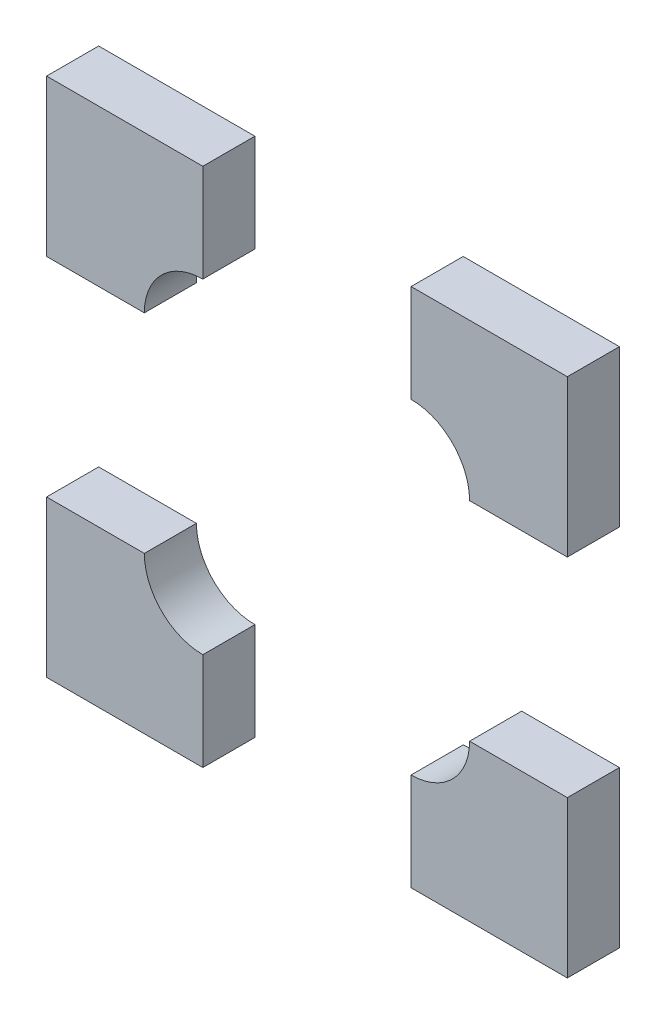
ISO-10303-21;
HEADER;
FILE_DESCRIPTION(('STEP AP214'),'2;1');
FILE_NAME('part.step','',(''),(''),'','','');
FILE_SCHEMA(('AUTOMOTIVE_DESIGN { 1 0 10303 214 1 1 1 1 }'));
ENDSEC;
DATA;
#1=APPLICATION_CONTEXT('core data for automotive mechanical design processes');
#2=APPLICATION_PROTOCOL_DEFINITION('international standard','automotive_design',2000,#1);
#3=PRODUCT_CONTEXT('',#1,'mechanical');
#4=PRODUCT('Part','Part','',(#3));
#5=PRODUCT_RELATED_PRODUCT_CATEGORY('part','',(#4));
#6=PRODUCT_DEFINITION_FORMATION('','',#4);
#7=PRODUCT_DEFINITION_CONTEXT('part definition',#1,'design');
#8=PRODUCT_DEFINITION('design','',#6,#7);
#9=PRODUCT_DEFINITION_SHAPE('','',#8);
#10=(LENGTH_UNIT() NAMED_UNIT(*) SI_UNIT(.MILLI.,.METRE.));
#11=(NAMED_UNIT(*) PLANE_ANGLE_UNIT() SI_UNIT($,.RADIAN.));
#12=(NAMED_UNIT(*) SI_UNIT($,.STERADIAN.) SOLID_ANGLE_UNIT());
#13=UNCERTAINTY_MEASURE_WITH_UNIT(LENGTH_MEASURE(1.E-05),#10,'distance_accuracy_value','');
#14=(GEOMETRIC_REPRESENTATION_CONTEXT(3) GLOBAL_UNCERTAINTY_ASSIGNED_CONTEXT((#13)) GLOBAL_UNIT_ASSIGNED_CONTEXT((#10,
#11,#12)) REPRESENTATION_CONTEXT('',''));
#15=CARTESIAN_POINT('',(0.,0.,0.));
#16=DIRECTION('',(0.,0.,1.));
#17=DIRECTION('',(1.,0.,0.));
#18=AXIS2_PLACEMENT_3D('',#15,#16,#17);
#19=CARTESIAN_POINT('',(2.,2.,1.));
#20=DIRECTION('',(0.,0.,-1.));
#21=DIRECTION('',(-1.,0.,0.));
#22=AXIS2_PLACEMENT_3D('',#19,#20,#21);
#23=CYLINDRICAL_SURFACE('',#22,1.1232180990878);
#24=CARTESIAN_POINT('',(2.,2.,0.));
#25=DIRECTION('',(0.,0.,1.));
#26=DIRECTION('',(1.,0.,0.));
#27=AXIS2_PLACEMENT_3D('',#24,#25,#26);
#28=CIRCLE('',#27,1.1232180990878);
#29=CARTESIAN_POINT('',(3.1232180990878,2.,0.));
#30=VERTEX_POINT('',#29);
#31=CARTESIAN_POINT('',(2.,3.12321809908781,0.));
#32=VERTEX_POINT('',#31);
#33=EDGE_CURVE('E120',#30,#32,#28,.T.);
#34=ORIENTED_EDGE('',*,*,#33,.F.);
#35=DIRECTION('',(0.,0.,-1.));
#36=VECTOR('',#35,1.);
#37=CARTESIAN_POINT('',(3.1232180990878,2.,1.));
#38=LINE('',#37,#36);
#39=CARTESIAN_POINT('',(3.1232180990878,2.,1.));
#40=VERTEX_POINT('',#39);
#41=EDGE_CURVE('E12',#40,#30,#38,.T.);
#42=ORIENTED_EDGE('',*,*,#41,.F.);
#43=CARTESIAN_POINT('',(2.,2.,1.));
#44=DIRECTION('',(0.,0.,1.));
#45=DIRECTION('',(1.,0.,0.));
#46=AXIS2_PLACEMENT_3D('',#43,#44,#45);
#47=CIRCLE('',#46,1.1232180990878);
#48=CARTESIAN_POINT('',(2.,3.12321809908781,1.));
#49=VERTEX_POINT('',#48);
#50=EDGE_CURVE('E131',#40,#49,#47,.T.);
#51=ORIENTED_EDGE('',*,*,#50,.T.);
#52=DIRECTION('',(0.,0.,-1.));
#53=VECTOR('',#52,1.);
#54=CARTESIAN_POINT('',(2.,3.12321809908781,1.));
#55=LINE('',#54,#53);
#56=EDGE_CURVE('E63',#49,#32,#55,.T.);
#57=ORIENTED_EDGE('',*,*,#56,.T.);
#58=EDGE_LOOP('',(#34,#42,#51,#57));
#59=FACE_BOUND('',#58,.T.);
#60=ADVANCED_FACE('F47',(#59),#23,.F.);
#61=CARTESIAN_POINT('',(0.,2.,1.));
#62=DIRECTION('',(0.,-1.,0.));
#63=DIRECTION('',(0.,0.,-1.));
#64=AXIS2_PLACEMENT_3D('',#61,#62,#63);
#65=PLANE('',#64);
#66=DIRECTION('',(-1.,0.,0.));
#67=VECTOR('',#66,1.);
#68=CARTESIAN_POINT('',(0.,2.,0.));
#69=LINE('',#68,#67);
#70=CARTESIAN_POINT('',(5.,2.,0.));
#71=VERTEX_POINT('',#70);
#72=EDGE_CURVE('E122',#71,#30,#69,.T.);
#73=ORIENTED_EDGE('',*,*,#72,.F.);
#74=DIRECTION('',(0.,0.,-1.));
#75=VECTOR('',#74,1.);
#76=CARTESIAN_POINT('',(5.,2.,1.));
#77=LINE('',#76,#75);
#78=CARTESIAN_POINT('',(5.,2.,1.));
#79=VERTEX_POINT('',#78);
#80=EDGE_CURVE('E55',#79,#71,#77,.T.);
#81=ORIENTED_EDGE('',*,*,#80,.F.);
#82=DIRECTION('',(-1.,0.,0.));
#83=VECTOR('',#82,1.);
#84=CARTESIAN_POINT('',(0.,2.,1.));
#85=LINE('',#84,#83);
#86=EDGE_CURVE('E103',#79,#40,#85,.T.);
#87=ORIENTED_EDGE('',*,*,#86,.T.);
#88=ORIENTED_EDGE('',*,*,#41,.T.);
#89=EDGE_LOOP('',(#73,#81,#87,#88));
#90=FACE_BOUND('',#89,.T.);
#91=ADVANCED_FACE('F137',(#90),#65,.T.);
#92=CARTESIAN_POINT('',(5.,0.,1.));
#93=DIRECTION('',(-1.,0.,0.));
#94=DIRECTION('',(0.,0.,1.));
#95=AXIS2_PLACEMENT_3D('',#92,#93,#94);
#96=PLANE('',#95);
#97=DIRECTION('',(0.,1.,0.));
#98=VECTOR('',#97,1.);
#99=CARTESIAN_POINT('',(5.,0.,0.));
#100=LINE('',#99,#98);
#101=CARTESIAN_POINT('',(5.,5.,0.));
#102=VERTEX_POINT('',#101);
#103=EDGE_CURVE('E110',#71,#102,#100,.T.);
#104=ORIENTED_EDGE('',*,*,#103,.T.);
#105=DIRECTION('',(0.,0.,-1.));
#106=VECTOR('',#105,1.);
#107=CARTESIAN_POINT('',(5.,5.,1.));
#108=LINE('',#107,#106);
#109=CARTESIAN_POINT('',(5.,5.,1.));
#110=VERTEX_POINT('',#109);
#111=EDGE_CURVE('E107',#110,#102,#108,.T.);
#112=ORIENTED_EDGE('',*,*,#111,.F.);
#113=DIRECTION('',(0.,1.,0.));
#114=VECTOR('',#113,1.);
#115=CARTESIAN_POINT('',(5.,0.,1.));
#116=LINE('',#115,#114);
#117=EDGE_CURVE('E96',#79,#110,#116,.T.);
#118=ORIENTED_EDGE('',*,*,#117,.F.);
#119=ORIENTED_EDGE('',*,*,#80,.T.);
#120=EDGE_LOOP('',(#104,#112,#118,#119));
#121=FACE_BOUND('',#120,.T.);
#122=ADVANCED_FACE('F108',(#121),#96,.F.);
#123=CARTESIAN_POINT('',(0.,5.,1.));
#124=DIRECTION('',(0.,-1.,0.));
#125=DIRECTION('',(1.,0.,0.));
#126=AXIS2_PLACEMENT_3D('',#123,#124,#125);
#127=PLANE('',#126);
#128=DIRECTION('',(-1.,0.,0.));
#129=VECTOR('',#128,1.);
#130=CARTESIAN_POINT('',(0.,5.,0.));
#131=LINE('',#130,#129);
#132=CARTESIAN_POINT('',(2.,5.,0.));
#133=VERTEX_POINT('',#132);
#134=EDGE_CURVE('E126',#102,#133,#131,.T.);
#135=ORIENTED_EDGE('',*,*,#134,.T.);
#136=DIRECTION('',(0.,0.,-1.));
#137=VECTOR('',#136,1.);
#138=CARTESIAN_POINT('',(2.,5.,1.));
#139=LINE('',#138,#137);
#140=CARTESIAN_POINT('',(2.,5.,1.));
#141=VERTEX_POINT('',#140);
#142=EDGE_CURVE('E80',#141,#133,#139,.T.);
#143=ORIENTED_EDGE('',*,*,#142,.F.);
#144=DIRECTION('',(-1.,0.,0.));
#145=VECTOR('',#144,1.);
#146=CARTESIAN_POINT('',(0.,5.,1.));
#147=LINE('',#146,#145);
#148=EDGE_CURVE('E101',#110,#141,#147,.T.);
#149=ORIENTED_EDGE('',*,*,#148,.F.);
#150=ORIENTED_EDGE('',*,*,#111,.T.);
#151=EDGE_LOOP('',(#135,#143,#149,#150));
#152=FACE_BOUND('',#151,.T.);
#153=ADVANCED_FACE('F114',(#152),#127,.F.);
#154=CARTESIAN_POINT('',(2.,0.,1.));
#155=DIRECTION('',(-1.,0.,0.));
#156=DIRECTION('',(0.,0.,1.));
#157=AXIS2_PLACEMENT_3D('',#154,#155,#156);
#158=PLANE('',#157);
#159=DIRECTION('',(0.,1.,0.));
#160=VECTOR('',#159,1.);
#161=CARTESIAN_POINT('',(2.,0.,0.));
#162=LINE('',#161,#160);
#163=EDGE_CURVE('E128',#32,#133,#162,.T.);
#164=ORIENTED_EDGE('',*,*,#163,.F.);
#165=ORIENTED_EDGE('',*,*,#56,.F.);
#166=DIRECTION('',(0.,1.,0.));
#167=VECTOR('',#166,1.);
#168=CARTESIAN_POINT('',(2.,0.,1.));
#169=LINE('',#168,#167);
#170=EDGE_CURVE('E115',#49,#141,#169,.T.);
#171=ORIENTED_EDGE('',*,*,#170,.T.);
#172=ORIENTED_EDGE('',*,*,#142,.T.);
#173=EDGE_LOOP('',(#164,#165,#171,#172));
#174=FACE_BOUND('',#173,.T.);
#175=ADVANCED_FACE('F138',(#174),#158,.T.);
#176=CARTESIAN_POINT('',(0.,0.,1.));
#177=DIRECTION('',(0.,0.,1.));
#178=DIRECTION('',(1.,0.,0.));
#179=AXIS2_PLACEMENT_3D('',#176,#177,#178);
#180=PLANE('',#179);
#181=ORIENTED_EDGE('',*,*,#50,.F.);
#182=ORIENTED_EDGE('',*,*,#86,.F.);
#183=ORIENTED_EDGE('',*,*,#117,.T.);
#184=ORIENTED_EDGE('',*,*,#148,.T.);
#185=ORIENTED_EDGE('',*,*,#170,.F.);
#186=EDGE_LOOP('',(#181,#182,#183,#184,#185));
#187=FACE_BOUND('',#186,.T.);
#188=ADVANCED_FACE('F98',(#187),#180,.T.);
#189=CARTESIAN_POINT('',(0.,0.,0.));
#190=DIRECTION('',(0.,0.,1.));
#191=DIRECTION('',(1.,0.,0.));
#192=AXIS2_PLACEMENT_3D('',#189,#190,#191);
#193=PLANE('',#192);
#194=ORIENTED_EDGE('',*,*,#33,.T.);
#195=ORIENTED_EDGE('',*,*,#163,.T.);
#196=ORIENTED_EDGE('',*,*,#134,.F.);
#197=ORIENTED_EDGE('',*,*,#103,.F.);
#198=ORIENTED_EDGE('',*,*,#72,.T.);
#199=EDGE_LOOP('',(#194,#195,#196,#197,#198));
#200=FACE_BOUND('',#199,.T.);
#201=ADVANCED_FACE('F136',(#200),#193,.F.);
#202=CLOSED_SHELL('',(#60,#91,#122,#153,#175,#188,#201));
#203=MANIFOLD_SOLID_BREP('B2',#202);
#204=CARTESIAN_POINT('',(2.,-2.,1.));
#205=DIRECTION('',(0.,0.,-1.));
#206=DIRECTION('',(-1.,0.,0.));
#207=AXIS2_PLACEMENT_3D('',#204,#205,#206);
#208=CYLINDRICAL_SURFACE('',#207,1.1232180990878);
#209=CARTESIAN_POINT('',(2.,-2.,0.));
#210=DIRECTION('',(0.,0.,1.));
#211=DIRECTION('',(1.,0.,0.));
#212=AXIS2_PLACEMENT_3D('',#209,#210,#211);
#213=CIRCLE('',#212,1.1232180990878);
#214=CARTESIAN_POINT('',(2.,-3.1232180990878,0.));
#215=VERTEX_POINT('',#214);
#216=CARTESIAN_POINT('',(3.1232180990878,-2.,0.));
#217=VERTEX_POINT('',#216);
#218=EDGE_CURVE('E280',#215,#217,#213,.T.);
#219=ORIENTED_EDGE('',*,*,#218,.F.);
#220=DIRECTION('',(0.,0.,-1.));
#221=VECTOR('',#220,1.);
#222=CARTESIAN_POINT('',(2.,-3.1232180990878,1.));
#223=LINE('',#222,#221);
#224=CARTESIAN_POINT('',(2.,-3.1232180990878,1.));
#225=VERTEX_POINT('',#224);
#226=EDGE_CURVE('E45',#225,#215,#223,.T.);
#227=ORIENTED_EDGE('',*,*,#226,.F.);
#228=CARTESIAN_POINT('',(2.,-2.,1.));
#229=DIRECTION('',(0.,0.,1.));
#230=DIRECTION('',(1.,0.,0.));
#231=AXIS2_PLACEMENT_3D('',#228,#229,#230);
#232=CIRCLE('',#231,1.1232180990878);
#233=CARTESIAN_POINT('',(3.1232180990878,-2.,1.));
#234=VERTEX_POINT('',#233);
#235=EDGE_CURVE('E275',#225,#234,#232,.T.);
#236=ORIENTED_EDGE('',*,*,#235,.T.);
#237=DIRECTION('',(0.,0.,-1.));
#238=VECTOR('',#237,1.);
#239=CARTESIAN_POINT('',(3.1232180990878,-2.,1.));
#240=LINE('',#239,#238);
#241=EDGE_CURVE('E247',#234,#217,#240,.T.);
#242=ORIENTED_EDGE('',*,*,#241,.T.);
#243=EDGE_LOOP('',(#219,#227,#236,#242));
#244=FACE_BOUND('',#243,.T.);
#245=ADVANCED_FACE('F206',(#244),#208,.F.);
#246=CARTESIAN_POINT('',(2.,0.,1.));
#247=DIRECTION('',(-1.,0.,0.));
#248=DIRECTION('',(0.,0.,1.));
#249=AXIS2_PLACEMENT_3D('',#246,#247,#248);
#250=PLANE('',#249);
#251=DIRECTION('',(0.,1.,0.));
#252=VECTOR('',#251,1.);
#253=CARTESIAN_POINT('',(2.,0.,0.));
#254=LINE('',#253,#252);
#255=CARTESIAN_POINT('',(2.,-5.,0.));
#256=VERTEX_POINT('',#255);
#257=EDGE_CURVE('E283',#256,#215,#254,.T.);
#258=ORIENTED_EDGE('',*,*,#257,.F.);
#259=DIRECTION('',(0.,0.,-1.));
#260=VECTOR('',#259,1.);
#261=CARTESIAN_POINT('',(2.,-5.,1.));
#262=LINE('',#261,#260);
#263=CARTESIAN_POINT('',(2.,-5.,1.));
#264=VERTEX_POINT('',#263);
#265=EDGE_CURVE('E214',#264,#256,#262,.T.);
#266=ORIENTED_EDGE('',*,*,#265,.F.);
#267=DIRECTION('',(0.,1.,0.));
#268=VECTOR('',#267,1.);
#269=CARTESIAN_POINT('',(2.,0.,1.));
#270=LINE('',#269,#268);
#271=EDGE_CURVE('E273',#264,#225,#270,.T.);
#272=ORIENTED_EDGE('',*,*,#271,.T.);
#273=ORIENTED_EDGE('',*,*,#226,.T.);
#274=EDGE_LOOP('',(#258,#266,#272,#273));
#275=FACE_BOUND('',#274,.T.);
#276=ADVANCED_FACE('F293',(#275),#250,.T.);
#277=CARTESIAN_POINT('',(0.,-5.,1.));
#278=DIRECTION('',(0.,-1.,0.));
#279=DIRECTION('',(1.,0.,0.));
#280=AXIS2_PLACEMENT_3D('',#277,#278,#279);
#281=PLANE('',#280);
#282=DIRECTION('',(-1.,0.,0.));
#283=VECTOR('',#282,1.);
#284=CARTESIAN_POINT('',(0.,-5.,0.));
#285=LINE('',#284,#283);
#286=CARTESIAN_POINT('',(5.,-5.,0.));
#287=VERTEX_POINT('',#286);
#288=EDGE_CURVE('E264',#287,#256,#285,.T.);
#289=ORIENTED_EDGE('',*,*,#288,.F.);
#290=DIRECTION('',(0.,0.,-1.));
#291=VECTOR('',#290,1.);
#292=CARTESIAN_POINT('',(5.,-5.,1.));
#293=LINE('',#292,#291);
#294=CARTESIAN_POINT('',(5.,-5.,1.));
#295=VERTEX_POINT('',#294);
#296=EDGE_CURVE('E258',#295,#287,#293,.T.);
#297=ORIENTED_EDGE('',*,*,#296,.F.);
#298=DIRECTION('',(-1.,0.,0.));
#299=VECTOR('',#298,1.);
#300=CARTESIAN_POINT('',(0.,-5.,1.));
#301=LINE('',#300,#299);
#302=EDGE_CURVE('E262',#295,#264,#301,.T.);
#303=ORIENTED_EDGE('',*,*,#302,.T.);
#304=ORIENTED_EDGE('',*,*,#265,.T.);
#305=EDGE_LOOP('',(#289,#297,#303,#304));
#306=FACE_BOUND('',#305,.T.);
#307=ADVANCED_FACE('F260',(#306),#281,.T.);
#308=CARTESIAN_POINT('',(5.,0.,1.));
#309=DIRECTION('',(-1.,0.,0.));
#310=DIRECTION('',(0.,0.,1.));
#311=AXIS2_PLACEMENT_3D('',#308,#309,#310);
#312=PLANE('',#311);
#313=DIRECTION('',(0.,1.,0.));
#314=VECTOR('',#313,1.);
#315=CARTESIAN_POINT('',(5.,0.,0.));
#316=LINE('',#315,#314);
#317=CARTESIAN_POINT('',(5.,-2.,0.));
#318=VERTEX_POINT('',#317);
#319=EDGE_CURVE('E240',#287,#318,#316,.T.);
#320=ORIENTED_EDGE('',*,*,#319,.T.);
#321=DIRECTION('',(0.,0.,-1.));
#322=VECTOR('',#321,1.);
#323=CARTESIAN_POINT('',(5.,-2.,1.));
#324=LINE('',#323,#322);
#325=CARTESIAN_POINT('',(5.,-2.,1.));
#326=VERTEX_POINT('',#325);
#327=EDGE_CURVE('E265',#326,#318,#324,.T.);
#328=ORIENTED_EDGE('',*,*,#327,.F.);
#329=DIRECTION('',(0.,1.,0.));
#330=VECTOR('',#329,1.);
#331=CARTESIAN_POINT('',(5.,0.,1.));
#332=LINE('',#331,#330);
#333=EDGE_CURVE('E267',#295,#326,#332,.T.);
#334=ORIENTED_EDGE('',*,*,#333,.F.);
#335=ORIENTED_EDGE('',*,*,#296,.T.);
#336=EDGE_LOOP('',(#320,#328,#334,#335));
#337=FACE_BOUND('',#336,.T.);
#338=ADVANCED_FACE('F268',(#337),#312,.F.);
#339=CARTESIAN_POINT('',(0.,-2.,1.));
#340=DIRECTION('',(0.,-1.,0.));
#341=DIRECTION('',(0.,0.,-1.));
#342=AXIS2_PLACEMENT_3D('',#339,#340,#341);
#343=PLANE('',#342);
#344=DIRECTION('',(-1.,0.,0.));
#345=VECTOR('',#344,1.);
#346=CARTESIAN_POINT('',(0.,-2.,0.));
#347=LINE('',#346,#345);
#348=EDGE_CURVE('E288',#318,#217,#347,.T.);
#349=ORIENTED_EDGE('',*,*,#348,.T.);
#350=ORIENTED_EDGE('',*,*,#241,.F.);
#351=DIRECTION('',(-1.,0.,0.));
#352=VECTOR('',#351,1.);
#353=CARTESIAN_POINT('',(0.,-2.,1.));
#354=LINE('',#353,#352);
#355=EDGE_CURVE('E222',#326,#234,#354,.T.);
#356=ORIENTED_EDGE('',*,*,#355,.F.);
#357=ORIENTED_EDGE('',*,*,#327,.T.);
#358=EDGE_LOOP('',(#349,#350,#356,#357));
#359=FACE_BOUND('',#358,.T.);
#360=ADVANCED_FACE('F298',(#359),#343,.F.);
#361=CARTESIAN_POINT('',(0.,0.,1.));
#362=DIRECTION('',(0.,0.,1.));
#363=DIRECTION('',(1.,0.,0.));
#364=AXIS2_PLACEMENT_3D('',#361,#362,#363);
#365=PLANE('',#364);
#366=ORIENTED_EDGE('',*,*,#235,.F.);
#367=ORIENTED_EDGE('',*,*,#271,.F.);
#368=ORIENTED_EDGE('',*,*,#302,.F.);
#369=ORIENTED_EDGE('',*,*,#333,.T.);
#370=ORIENTED_EDGE('',*,*,#355,.T.);
#371=EDGE_LOOP('',(#366,#367,#368,#369,#370));
#372=FACE_BOUND('',#371,.T.);
#373=ADVANCED_FACE('F271',(#372),#365,.T.);
#374=CARTESIAN_POINT('',(0.,0.,0.));
#375=DIRECTION('',(0.,0.,1.));
#376=DIRECTION('',(1.,0.,0.));
#377=AXIS2_PLACEMENT_3D('',#374,#375,#376);
#378=PLANE('',#377);
#379=ORIENTED_EDGE('',*,*,#218,.T.);
#380=ORIENTED_EDGE('',*,*,#348,.F.);
#381=ORIENTED_EDGE('',*,*,#319,.F.);
#382=ORIENTED_EDGE('',*,*,#288,.T.);
#383=ORIENTED_EDGE('',*,*,#257,.T.);
#384=EDGE_LOOP('',(#379,#380,#381,#382,#383));
#385=FACE_BOUND('',#384,.T.);
#386=ADVANCED_FACE('F295',(#385),#378,.F.);
#387=CLOSED_SHELL('',(#245,#276,#307,#338,#360,#373,#386));
#388=MANIFOLD_SOLID_BREP('B6',#387);
#389=CARTESIAN_POINT('',(-2.,-2.,1.));
#390=DIRECTION('',(0.,0.,-1.));
#391=DIRECTION('',(-1.,0.,0.));
#392=AXIS2_PLACEMENT_3D('',#389,#390,#391);
#393=CYLINDRICAL_SURFACE('',#392,1.1232180990878);
#394=CARTESIAN_POINT('',(-2.,-2.,0.));
#395=DIRECTION('',(0.,0.,1.));
#396=DIRECTION('',(1.,0.,0.));
#397=AXIS2_PLACEMENT_3D('',#394,#395,#396);
#398=CIRCLE('',#397,1.1232180990878);
#399=CARTESIAN_POINT('',(-3.12321809908781,-2.,0.));
#400=VERTEX_POINT('',#399);
#401=CARTESIAN_POINT('',(-2.,-3.1232180990878,0.));
#402=VERTEX_POINT('',#401);
#403=EDGE_CURVE('E437',#400,#402,#398,.T.);
#404=ORIENTED_EDGE('',*,*,#403,.F.);
#405=DIRECTION('',(0.,0.,-1.));
#406=VECTOR('',#405,1.);
#407=CARTESIAN_POINT('',(-3.12321809908781,-2.,1.));
#408=LINE('',#407,#406);
#409=CARTESIAN_POINT('',(-3.12321809908781,-2.,1.));
#410=VERTEX_POINT('',#409);
#411=EDGE_CURVE('E204',#410,#400,#408,.T.);
#412=ORIENTED_EDGE('',*,*,#411,.F.);
#413=CARTESIAN_POINT('',(-2.,-2.,1.));
#414=DIRECTION('',(0.,0.,1.));
#415=DIRECTION('',(1.,0.,0.));
#416=AXIS2_PLACEMENT_3D('',#413,#414,#415);
#417=CIRCLE('',#416,1.1232180990878);
#418=CARTESIAN_POINT('',(-2.,-3.1232180990878,1.));
#419=VERTEX_POINT('',#418);
#420=EDGE_CURVE('E448',#410,#419,#417,.T.);
#421=ORIENTED_EDGE('',*,*,#420,.T.);
#422=DIRECTION('',(0.,0.,-1.));
#423=VECTOR('',#422,1.);
#424=CARTESIAN_POINT('',(-2.,-3.1232180990878,1.));
#425=LINE('',#424,#423);
#426=EDGE_CURVE('E405',#419,#402,#425,.T.);
#427=ORIENTED_EDGE('',*,*,#426,.T.);
#428=EDGE_LOOP('',(#404,#412,#421,#427));
#429=FACE_BOUND('',#428,.T.);
#430=ADVANCED_FACE('F364',(#429),#393,.F.);
#431=CARTESIAN_POINT('',(0.,-2.,1.));
#432=DIRECTION('',(0.,-1.,0.));
#433=DIRECTION('',(0.,0.,-1.));
#434=AXIS2_PLACEMENT_3D('',#431,#432,#433);
#435=PLANE('',#434);
#436=DIRECTION('',(-1.,0.,0.));
#437=VECTOR('',#436,1.);
#438=CARTESIAN_POINT('',(0.,-2.,0.));
#439=LINE('',#438,#437);
#440=CARTESIAN_POINT('',(-5.,-2.,0.));
#441=VERTEX_POINT('',#440);
#442=EDGE_CURVE('E440',#400,#441,#439,.T.);
#443=ORIENTED_EDGE('',*,*,#442,.T.);
#444=DIRECTION('',(0.,0.,-1.));
#445=VECTOR('',#444,1.);
#446=CARTESIAN_POINT('',(-5.,-2.,1.));
#447=LINE('',#446,#445);
#448=CARTESIAN_POINT('',(-5.,-2.,1.));
#449=VERTEX_POINT('',#448);
#450=EDGE_CURVE('E372',#449,#441,#447,.T.);
#451=ORIENTED_EDGE('',*,*,#450,.F.);
#452=DIRECTION('',(-1.,0.,0.));
#453=VECTOR('',#452,1.);
#454=CARTESIAN_POINT('',(0.,-2.,1.));
#455=LINE('',#454,#453);
#456=EDGE_CURVE('E429',#410,#449,#455,.T.);
#457=ORIENTED_EDGE('',*,*,#456,.F.);
#458=ORIENTED_EDGE('',*,*,#411,.T.);
#459=EDGE_LOOP('',(#443,#451,#457,#458));
#460=FACE_BOUND('',#459,.T.);
#461=ADVANCED_FACE('F452',(#460),#435,.F.);
#462=CARTESIAN_POINT('',(-5.,0.,1.));
#463=DIRECTION('',(-1.,0.,0.));
#464=DIRECTION('',(0.,-1.,0.));
#465=AXIS2_PLACEMENT_3D('',#462,#463,#464);
#466=PLANE('',#465);
#467=DIRECTION('',(0.,1.,0.));
#468=VECTOR('',#467,1.);
#469=CARTESIAN_POINT('',(-5.,0.,0.));
#470=LINE('',#469,#468);
#471=CARTESIAN_POINT('',(-5.,-5.,0.));
#472=VERTEX_POINT('',#471);
#473=EDGE_CURVE('E421',#472,#441,#470,.T.);
#474=ORIENTED_EDGE('',*,*,#473,.F.);
#475=DIRECTION('',(0.,0.,-1.));
#476=VECTOR('',#475,1.);
#477=CARTESIAN_POINT('',(-5.,-5.,1.));
#478=LINE('',#477,#476);
#479=CARTESIAN_POINT('',(-5.,-5.,1.));
#480=VERTEX_POINT('',#479);
#481=EDGE_CURVE('E416',#480,#472,#478,.T.);
#482=ORIENTED_EDGE('',*,*,#481,.F.);
#483=DIRECTION('',(0.,1.,0.));
#484=VECTOR('',#483,1.);
#485=CARTESIAN_POINT('',(-5.,0.,1.));
#486=LINE('',#485,#484);
#487=EDGE_CURVE('E419',#480,#449,#486,.T.);
#488=ORIENTED_EDGE('',*,*,#487,.T.);
#489=ORIENTED_EDGE('',*,*,#450,.T.);
#490=EDGE_LOOP('',(#474,#482,#488,#489));
#491=FACE_BOUND('',#490,.T.);
#492=ADVANCED_FACE('F418',(#491),#466,.T.);
#493=CARTESIAN_POINT('',(0.,-5.,1.));
#494=DIRECTION('',(0.,-1.,0.));
#495=DIRECTION('',(1.,0.,0.));
#496=AXIS2_PLACEMENT_3D('',#493,#494,#495);
#497=PLANE('',#496);
#498=DIRECTION('',(-1.,0.,0.));
#499=VECTOR('',#498,1.);
#500=CARTESIAN_POINT('',(0.,-5.,0.));
#501=LINE('',#500,#499);
#502=CARTESIAN_POINT('',(-2.,-5.,0.));
#503=VERTEX_POINT('',#502);
#504=EDGE_CURVE('E444',#503,#472,#501,.T.);
#505=ORIENTED_EDGE('',*,*,#504,.F.);
#506=DIRECTION('',(0.,0.,-1.));
#507=VECTOR('',#506,1.);
#508=CARTESIAN_POINT('',(-2.,-5.,1.));
#509=LINE('',#508,#507);
#510=CARTESIAN_POINT('',(-2.,-5.,1.));
#511=VERTEX_POINT('',#510);
#512=EDGE_CURVE('E398',#511,#503,#509,.T.);
#513=ORIENTED_EDGE('',*,*,#512,.F.);
#514=DIRECTION('',(-1.,0.,0.));
#515=VECTOR('',#514,1.);
#516=CARTESIAN_POINT('',(0.,-5.,1.));
#517=LINE('',#516,#515);
#518=EDGE_CURVE('E428',#511,#480,#517,.T.);
#519=ORIENTED_EDGE('',*,*,#518,.T.);
#520=ORIENTED_EDGE('',*,*,#481,.T.);
#521=EDGE_LOOP('',(#505,#513,#519,#520));
#522=FACE_BOUND('',#521,.T.);
#523=ADVANCED_FACE('F432',(#522),#497,.T.);
#524=CARTESIAN_POINT('',(-2.,0.,1.));
#525=DIRECTION('',(-1.,0.,0.));
#526=DIRECTION('',(0.,0.,1.));
#527=AXIS2_PLACEMENT_3D('',#524,#525,#526);
#528=PLANE('',#527);
#529=DIRECTION('',(0.,1.,0.));
#530=VECTOR('',#529,1.);
#531=CARTESIAN_POINT('',(-2.,0.,0.));
#532=LINE('',#531,#530);
#533=EDGE_CURVE('E446',#503,#402,#532,.T.);
#534=ORIENTED_EDGE('',*,*,#533,.T.);
#535=ORIENTED_EDGE('',*,*,#426,.F.);
#536=DIRECTION('',(0.,1.,0.));
#537=VECTOR('',#536,1.);
#538=CARTESIAN_POINT('',(-2.,0.,1.));
#539=LINE('',#538,#537);
#540=EDGE_CURVE('E380',#511,#419,#539,.T.);
#541=ORIENTED_EDGE('',*,*,#540,.F.);
#542=ORIENTED_EDGE('',*,*,#512,.T.);
#543=EDGE_LOOP('',(#534,#535,#541,#542));
#544=FACE_BOUND('',#543,.T.);
#545=ADVANCED_FACE('F455',(#544),#528,.F.);
#546=CARTESIAN_POINT('',(0.,0.,1.));
#547=DIRECTION('',(0.,0.,1.));
#548=DIRECTION('',(1.,0.,0.));
#549=AXIS2_PLACEMENT_3D('',#546,#547,#548);
#550=PLANE('',#549);
#551=ORIENTED_EDGE('',*,*,#420,.F.);
#552=ORIENTED_EDGE('',*,*,#456,.T.);
#553=ORIENTED_EDGE('',*,*,#487,.F.);
#554=ORIENTED_EDGE('',*,*,#518,.F.);
#555=ORIENTED_EDGE('',*,*,#540,.T.);
#556=EDGE_LOOP('',(#551,#552,#553,#554,#555));
#557=FACE_BOUND('',#556,.T.);
#558=ADVANCED_FACE('F427',(#557),#550,.T.);
#559=CARTESIAN_POINT('',(0.,0.,0.));
#560=DIRECTION('',(0.,0.,1.));
#561=DIRECTION('',(1.,0.,0.));
#562=AXIS2_PLACEMENT_3D('',#559,#560,#561);
#563=PLANE('',#562);
#564=ORIENTED_EDGE('',*,*,#403,.T.);
#565=ORIENTED_EDGE('',*,*,#533,.F.);
#566=ORIENTED_EDGE('',*,*,#504,.T.);
#567=ORIENTED_EDGE('',*,*,#473,.T.);
#568=ORIENTED_EDGE('',*,*,#442,.F.);
#569=EDGE_LOOP('',(#564,#565,#566,#567,#568));
#570=FACE_BOUND('',#569,.T.);
#571=ADVANCED_FACE('F454',(#570),#563,.F.);
#572=CLOSED_SHELL('',(#430,#461,#492,#523,#545,#558,#571));
#573=MANIFOLD_SOLID_BREP('B39',#572);
#574=CARTESIAN_POINT('',(-2.,2.,1.));
#575=DIRECTION('',(0.,0.,-1.));
#576=DIRECTION('',(-1.,0.,0.));
#577=AXIS2_PLACEMENT_3D('',#574,#575,#576);
#578=CYLINDRICAL_SURFACE('',#577,1.1232180990878);
#579=CARTESIAN_POINT('',(-2.,2.,0.));
#580=DIRECTION('',(0.,0.,1.));
#581=DIRECTION('',(1.,0.,0.));
#582=AXIS2_PLACEMENT_3D('',#579,#580,#581);
#583=CIRCLE('',#582,1.1232180990878);
#584=CARTESIAN_POINT('',(-2.,3.12321809908781,0.));
#585=VERTEX_POINT('',#584);
#586=CARTESIAN_POINT('',(-3.12321809908781,2.,0.));
#587=VERTEX_POINT('',#586);
#588=EDGE_CURVE('E587',#585,#587,#583,.T.);
#589=ORIENTED_EDGE('',*,*,#588,.F.);
#590=DIRECTION('',(0.,0.,-1.));
#591=VECTOR('',#590,1.);
#592=CARTESIAN_POINT('',(-2.,3.12321809908781,1.));
#593=LINE('',#592,#591);
#594=CARTESIAN_POINT('',(-2.,3.12321809908781,1.));
#595=VERTEX_POINT('',#594);
#596=EDGE_CURVE('E362',#595,#585,#593,.T.);
#597=ORIENTED_EDGE('',*,*,#596,.F.);
#598=CARTESIAN_POINT('',(-2.,2.,1.));
#599=DIRECTION('',(0.,0.,1.));
#600=DIRECTION('',(1.,0.,0.));
#601=AXIS2_PLACEMENT_3D('',#598,#599,#600);
#602=CIRCLE('',#601,1.1232180990878);
#603=CARTESIAN_POINT('',(-3.12321809908781,2.,1.));
#604=VERTEX_POINT('',#603);
#605=EDGE_CURVE('E597',#595,#604,#602,.T.);
#606=ORIENTED_EDGE('',*,*,#605,.T.);
#607=DIRECTION('',(0.,0.,-1.));
#608=VECTOR('',#607,1.);
#609=CARTESIAN_POINT('',(-3.12321809908781,2.,1.));
#610=LINE('',#609,#608);
#611=EDGE_CURVE('E529',#604,#587,#610,.T.);
#612=ORIENTED_EDGE('',*,*,#611,.T.);
#613=EDGE_LOOP('',(#589,#597,#606,#612));
#614=FACE_BOUND('',#613,.T.);
#615=ADVANCED_FACE('F513',(#614),#578,.F.);
#616=CARTESIAN_POINT('',(-2.,0.,1.));
#617=DIRECTION('',(-1.,0.,0.));
#618=DIRECTION('',(0.,0.,1.));
#619=AXIS2_PLACEMENT_3D('',#616,#617,#618);
#620=PLANE('',#619);
#621=DIRECTION('',(0.,1.,0.));
#622=VECTOR('',#621,1.);
#623=CARTESIAN_POINT('',(-2.,0.,0.));
#624=LINE('',#623,#622);
#625=CARTESIAN_POINT('',(-2.,5.,0.));
#626=VERTEX_POINT('',#625);
#627=EDGE_CURVE('E589',#585,#626,#624,.T.);
#628=ORIENTED_EDGE('',*,*,#627,.T.);
#629=DIRECTION('',(0.,0.,-1.));
#630=VECTOR('',#629,1.);
#631=CARTESIAN_POINT('',(-2.,5.,1.));
#632=LINE('',#631,#630);
#633=CARTESIAN_POINT('',(-2.,5.,1.));
#634=VERTEX_POINT('',#633);
#635=EDGE_CURVE('E521',#634,#626,#632,.T.);
#636=ORIENTED_EDGE('',*,*,#635,.F.);
#637=DIRECTION('',(0.,1.,0.));
#638=VECTOR('',#637,1.);
#639=CARTESIAN_POINT('',(-2.,0.,1.));
#640=LINE('',#639,#638);
#641=EDGE_CURVE('E568',#595,#634,#640,.T.);
#642=ORIENTED_EDGE('',*,*,#641,.F.);
#643=ORIENTED_EDGE('',*,*,#596,.T.);
#644=EDGE_LOOP('',(#628,#636,#642,#643));
#645=FACE_BOUND('',#644,.T.);
#646=ADVANCED_FACE('F614',(#645),#620,.F.);
#647=CARTESIAN_POINT('',(0.,5.,1.));
#648=DIRECTION('',(0.,-1.,0.));
#649=DIRECTION('',(1.,0.,0.));
#650=AXIS2_PLACEMENT_3D('',#647,#648,#649);
#651=PLANE('',#650);
#652=DIRECTION('',(-1.,0.,0.));
#653=VECTOR('',#652,1.);
#654=CARTESIAN_POINT('',(0.,5.,0.));
#655=LINE('',#654,#653);
#656=CARTESIAN_POINT('',(-5.,5.,0.));
#657=VERTEX_POINT('',#656);
#658=EDGE_CURVE('E577',#626,#657,#655,.T.);
#659=ORIENTED_EDGE('',*,*,#658,.T.);
#660=DIRECTION('',(0.,0.,-1.));
#661=VECTOR('',#660,1.);
#662=CARTESIAN_POINT('',(-5.,5.,1.));
#663=LINE('',#662,#661);
#664=CARTESIAN_POINT('',(-5.,5.,1.));
#665=VERTEX_POINT('',#664);
#666=EDGE_CURVE('E574',#665,#657,#663,.T.);
#667=ORIENTED_EDGE('',*,*,#666,.F.);
#668=DIRECTION('',(-1.,0.,0.));
#669=VECTOR('',#668,1.);
#670=CARTESIAN_POINT('',(0.,5.,1.));
#671=LINE('',#670,#669);
#672=EDGE_CURVE('E561',#634,#665,#671,.T.);
#673=ORIENTED_EDGE('',*,*,#672,.F.);
#674=ORIENTED_EDGE('',*,*,#635,.T.);
#675=EDGE_LOOP('',(#659,#667,#673,#674));
#676=FACE_BOUND('',#675,.T.);
#677=ADVANCED_FACE('F575',(#676),#651,.F.);
#678=CARTESIAN_POINT('',(-5.,0.,1.));
#679=DIRECTION('',(-1.,0.,0.));
#680=DIRECTION('',(0.,-1.,0.));
#681=AXIS2_PLACEMENT_3D('',#678,#679,#680);
#682=PLANE('',#681);
#683=DIRECTION('',(0.,1.,0.));
#684=VECTOR('',#683,1.);
#685=CARTESIAN_POINT('',(-5.,0.,0.));
#686=LINE('',#685,#684);
#687=CARTESIAN_POINT('',(-5.,2.,0.));
#688=VERTEX_POINT('',#687);
#689=EDGE_CURVE('E592',#688,#657,#686,.T.);
#690=ORIENTED_EDGE('',*,*,#689,.F.);
#691=DIRECTION('',(0.,0.,-1.));
#692=VECTOR('',#691,1.);
#693=CARTESIAN_POINT('',(-5.,2.,1.));
#694=LINE('',#693,#692);
#695=CARTESIAN_POINT('',(-5.,2.,1.));
#696=VERTEX_POINT('',#695);
#697=EDGE_CURVE('E545',#696,#688,#694,.T.);
#698=ORIENTED_EDGE('',*,*,#697,.F.);
#699=DIRECTION('',(0.,1.,0.));
#700=VECTOR('',#699,1.);
#701=CARTESIAN_POINT('',(-5.,0.,1.));
#702=LINE('',#701,#700);
#703=EDGE_CURVE('E567',#696,#665,#702,.T.);
#704=ORIENTED_EDGE('',*,*,#703,.T.);
#705=ORIENTED_EDGE('',*,*,#666,.T.);
#706=EDGE_LOOP('',(#690,#698,#704,#705));
#707=FACE_BOUND('',#706,.T.);
#708=ADVANCED_FACE('F581',(#707),#682,.T.);
#709=CARTESIAN_POINT('',(0.,2.,1.));
#710=DIRECTION('',(0.,-1.,0.));
#711=DIRECTION('',(0.,0.,-1.));
#712=AXIS2_PLACEMENT_3D('',#709,#710,#711);
#713=PLANE('',#712);
#714=DIRECTION('',(-1.,0.,0.));
#715=VECTOR('',#714,1.);
#716=CARTESIAN_POINT('',(0.,2.,0.));
#717=LINE('',#716,#715);
#718=EDGE_CURVE('E594',#587,#688,#717,.T.);
#719=ORIENTED_EDGE('',*,*,#718,.F.);
#720=ORIENTED_EDGE('',*,*,#611,.F.);
#721=DIRECTION('',(-1.,0.,0.));
#722=VECTOR('',#721,1.);
#723=CARTESIAN_POINT('',(0.,2.,1.));
#724=LINE('',#723,#722);
#725=EDGE_CURVE('E582',#604,#696,#724,.T.);
#726=ORIENTED_EDGE('',*,*,#725,.T.);
#727=ORIENTED_EDGE('',*,*,#697,.T.);
#728=EDGE_LOOP('',(#719,#720,#726,#727));
#729=FACE_BOUND('',#728,.T.);
#730=ADVANCED_FACE('F603',(#729),#713,.T.);
#731=CARTESIAN_POINT('',(0.,0.,1.));
#732=DIRECTION('',(0.,0.,1.));
#733=DIRECTION('',(1.,0.,0.));
#734=AXIS2_PLACEMENT_3D('',#731,#732,#733);
#735=PLANE('',#734);
#736=ORIENTED_EDGE('',*,*,#605,.F.);
#737=ORIENTED_EDGE('',*,*,#641,.T.);
#738=ORIENTED_EDGE('',*,*,#672,.T.);
#739=ORIENTED_EDGE('',*,*,#703,.F.);
#740=ORIENTED_EDGE('',*,*,#725,.F.);
#741=EDGE_LOOP('',(#736,#737,#738,#739,#740));
#742=FACE_BOUND('',#741,.T.);
#743=ADVANCED_FACE('F564',(#742),#735,.T.);
#744=CARTESIAN_POINT('',(0.,0.,0.));
#745=DIRECTION('',(0.,0.,1.));
#746=DIRECTION('',(1.,0.,0.));
#747=AXIS2_PLACEMENT_3D('',#744,#745,#746);
#748=PLANE('',#747);
#749=ORIENTED_EDGE('',*,*,#588,.T.);
#750=ORIENTED_EDGE('',*,*,#718,.T.);
#751=ORIENTED_EDGE('',*,*,#689,.T.);
#752=ORIENTED_EDGE('',*,*,#658,.F.);
#753=ORIENTED_EDGE('',*,*,#627,.F.);
#754=EDGE_LOOP('',(#749,#750,#751,#752,#753));
#755=FACE_BOUND('',#754,.T.);
#756=ADVANCED_FACE('F602',(#755),#748,.F.);
#757=CLOSED_SHELL('',(#615,#646,#677,#708,#730,#743,#756));
#758=MANIFOLD_SOLID_BREP('B198',#757);
#759=ADVANCED_BREP_SHAPE_REPRESENTATION('',(#18,#203,#388,#573,#758),#14);
#760=SHAPE_DEFINITION_REPRESENTATION(#9,#759);
ENDSEC;
END-ISO-10303-21;
